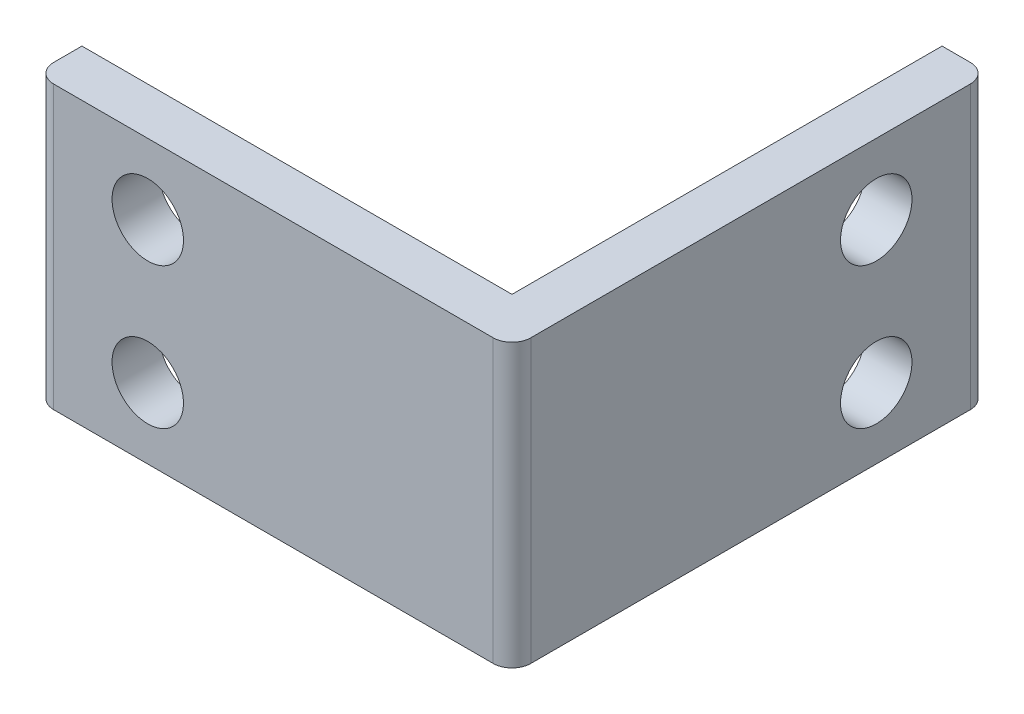
ISO-10303-21;
HEADER;
FILE_DESCRIPTION(('STEP AP214'),'2;1');
FILE_NAME('part.step','',(''),(''),'','','');
FILE_SCHEMA(('AUTOMOTIVE_DESIGN { 1 0 10303 214 1 1 1 1 }'));
ENDSEC;
DATA;
#1=APPLICATION_CONTEXT('core data for automotive mechanical design processes');
#2=APPLICATION_PROTOCOL_DEFINITION('international standard','automotive_design',2000,#1);
#3=PRODUCT_CONTEXT('',#1,'mechanical');
#4=PRODUCT('Part','Part','',(#3));
#5=PRODUCT_RELATED_PRODUCT_CATEGORY('part','',(#4));
#6=PRODUCT_DEFINITION_FORMATION('','',#4);
#7=PRODUCT_DEFINITION_CONTEXT('part definition',#1,'design');
#8=PRODUCT_DEFINITION('design','',#6,#7);
#9=PRODUCT_DEFINITION_SHAPE('','',#8);
#10=(LENGTH_UNIT() NAMED_UNIT(*) SI_UNIT(.MILLI.,.METRE.));
#11=(NAMED_UNIT(*) PLANE_ANGLE_UNIT() SI_UNIT($,.RADIAN.));
#12=(NAMED_UNIT(*) SI_UNIT($,.STERADIAN.) SOLID_ANGLE_UNIT());
#13=UNCERTAINTY_MEASURE_WITH_UNIT(LENGTH_MEASURE(1.E-05),#10,'distance_accuracy_value','');
#14=(GEOMETRIC_REPRESENTATION_CONTEXT(3) GLOBAL_UNCERTAINTY_ASSIGNED_CONTEXT((#13)) GLOBAL_UNIT_ASSIGNED_CONTEXT((#10,
#11,#12)) REPRESENTATION_CONTEXT('',''));
#15=CARTESIAN_POINT('',(0.,0.,0.));
#16=DIRECTION('',(0.,0.,1.));
#17=DIRECTION('',(1.,0.,0.));
#18=AXIS2_PLACEMENT_3D('',#15,#16,#17);
#19=CARTESIAN_POINT('',(0.,0.,-6.35));
#20=DIRECTION('',(-1.,0.,0.));
#21=DIRECTION('',(0.,0.,1.));
#22=AXIS2_PLACEMENT_3D('',#19,#20,#21);
#23=PLANE('',#22);
#24=DIRECTION('',(0.,0.,1.));
#25=VECTOR('',#24,1.);
#26=CARTESIAN_POINT('',(0.,0.,-6.35));
#27=LINE('',#26,#25);
#28=CARTESIAN_POINT('',(0.,0.,-6.35));
#29=VERTEX_POINT('',#28);
#30=CARTESIAN_POINT('',(0.,0.,-2.54));
#31=VERTEX_POINT('',#30);
#32=EDGE_CURVE('E146',#29,#31,#27,.T.);
#33=ORIENTED_EDGE('',*,*,#32,.T.);
#34=DIRECTION('',(0.,-1.,0.));
#35=VECTOR('',#34,1.);
#36=CARTESIAN_POINT('',(0.,38.1,-2.54));
#37=LINE('',#36,#35);
#38=CARTESIAN_POINT('',(0.,38.1,-2.54));
#39=VERTEX_POINT('',#38);
#40=EDGE_CURVE('E170',#31,#39,#37,.F.);
#41=ORIENTED_EDGE('',*,*,#40,.T.);
#42=DIRECTION('',(0.,0.,1.));
#43=VECTOR('',#42,1.);
#44=CARTESIAN_POINT('',(0.,38.1,-6.35));
#45=LINE('',#44,#43);
#46=CARTESIAN_POINT('',(0.,38.1,-6.35));
#47=VERTEX_POINT('',#46);
#48=EDGE_CURVE('E150',#47,#39,#45,.T.);
#49=ORIENTED_EDGE('',*,*,#48,.F.);
#50=DIRECTION('',(0.,-1.,0.));
#51=VECTOR('',#50,1.);
#52=CARTESIAN_POINT('',(0.,0.,-6.35));
#53=LINE('',#52,#51);
#54=EDGE_CURVE('E139',#47,#29,#53,.T.);
#55=ORIENTED_EDGE('',*,*,#54,.T.);
#56=EDGE_LOOP('',(#33,#41,#49,#55));
#57=FACE_BOUND('',#56,.T.);
#58=ADVANCED_FACE('F35',(#57),#23,.T.);
#59=CARTESIAN_POINT('',(0.,38.1,-6.35));
#60=DIRECTION('',(0.,1.,0.));
#61=DIRECTION('',(0.,0.,1.));
#62=AXIS2_PLACEMENT_3D('',#59,#60,#61);
#63=PLANE('',#62);
#64=DIRECTION('',(-1.,0.,0.));
#65=VECTOR('',#64,1.);
#66=CARTESIAN_POINT('',(0.,38.1,0.));
#67=LINE('',#66,#65);
#68=CARTESIAN_POINT('',(61.8998,38.1,0.));
#69=VERTEX_POINT('',#68);
#70=CARTESIAN_POINT('',(2.54,38.1,0.));
#71=VERTEX_POINT('',#70);
#72=EDGE_CURVE('E142',#69,#71,#67,.T.);
#73=ORIENTED_EDGE('',*,*,#72,.F.);
#74=CARTESIAN_POINT('',(61.8998,38.1,-2.54));
#75=DIRECTION('',(0.,1.,0.));
#76=DIRECTION('',(0.,0.,1.));
#77=AXIS2_PLACEMENT_3D('',#74,#75,#76);
#78=CIRCLE('',#77,2.54);
#79=CARTESIAN_POINT('',(64.4398,38.1,-2.54));
#80=VERTEX_POINT('',#79);
#81=EDGE_CURVE('E57',#69,#80,#78,.T.);
#82=ORIENTED_EDGE('',*,*,#81,.T.);
#83=DIRECTION('',(0.,0.,1.));
#84=VECTOR('',#83,1.);
#85=CARTESIAN_POINT('',(64.4398,38.1,-6.35));
#86=LINE('',#85,#84);
#87=CARTESIAN_POINT('',(64.4398,38.1,-61.8998));
#88=VERTEX_POINT('',#87);
#89=EDGE_CURVE('E154',#88,#80,#86,.T.);
#90=ORIENTED_EDGE('',*,*,#89,.F.);
#91=CARTESIAN_POINT('',(61.8998,38.1,-61.8998));
#92=DIRECTION('',(0.,1.,0.));
#93=DIRECTION('',(0.,0.,1.));
#94=AXIS2_PLACEMENT_3D('',#91,#92,#93);
#95=CIRCLE('',#94,2.54);
#96=CARTESIAN_POINT('',(61.8998,38.1,-64.4398));
#97=VERTEX_POINT('',#96);
#98=EDGE_CURVE('E178',#88,#97,#95,.T.);
#99=ORIENTED_EDGE('',*,*,#98,.T.);
#100=DIRECTION('',(1.,0.,0.));
#101=VECTOR('',#100,1.);
#102=CARTESIAN_POINT('',(58.0898,38.1,-64.4398));
#103=LINE('',#102,#101);
#104=CARTESIAN_POINT('',(58.0898,38.1,-64.4398));
#105=VERTEX_POINT('',#104);
#106=EDGE_CURVE('E126',#105,#97,#103,.T.);
#107=ORIENTED_EDGE('',*,*,#106,.F.);
#108=DIRECTION('',(0.,0.,1.));
#109=VECTOR('',#108,1.);
#110=CARTESIAN_POINT('',(58.0898,38.1,0.));
#111=LINE('',#110,#109);
#112=CARTESIAN_POINT('',(58.0898,38.1,-6.35));
#113=VERTEX_POINT('',#112);
#114=EDGE_CURVE('E127',#105,#113,#111,.T.);
#115=ORIENTED_EDGE('',*,*,#114,.T.);
#116=DIRECTION('',(-1.,0.,0.));
#117=VECTOR('',#116,1.);
#118=CARTESIAN_POINT('',(0.,38.1,-6.35));
#119=LINE('',#118,#117);
#120=EDGE_CURVE('E144',#113,#47,#119,.T.);
#121=ORIENTED_EDGE('',*,*,#120,.T.);
#122=ORIENTED_EDGE('',*,*,#48,.T.);
#123=CARTESIAN_POINT('',(2.54,38.1,-2.54));
#124=DIRECTION('',(0.,1.,0.));
#125=DIRECTION('',(0.,0.,1.));
#126=AXIS2_PLACEMENT_3D('',#123,#124,#125);
#127=CIRCLE('',#126,2.54);
#128=EDGE_CURVE('E172',#39,#71,#127,.T.);
#129=ORIENTED_EDGE('',*,*,#128,.T.);
#130=EDGE_LOOP('',(#73,#82,#90,#99,#107,#115,#121,#122,#129));
#131=FACE_BOUND('',#130,.T.);
#132=ADVANCED_FACE('F192',(#131),#63,.T.);
#133=CARTESIAN_POINT('',(64.4398,0.,-6.35));
#134=DIRECTION('',(1.,0.,0.));
#135=DIRECTION('',(0.,0.,-1.));
#136=AXIS2_PLACEMENT_3D('',#133,#134,#135);
#137=PLANE('',#136);
#138=CARTESIAN_POINT('',(64.4398,28.575,-49.1998));
#139=DIRECTION('',(1.,0.,0.));
#140=DIRECTION('',(0.,0.,-1.));
#141=AXIS2_PLACEMENT_3D('',#138,#139,#140);
#142=CIRCLE('',#141,4.826);
#143=CARTESIAN_POINT('',(64.4398,28.575,-54.0258));
#144=VERTEX_POINT('',#143);
#145=EDGE_CURVE('E163',#144,#144,#142,.T.);
#146=ORIENTED_EDGE('',*,*,#145,.F.);
#147=EDGE_LOOP('',(#146));
#148=FACE_BOUND('',#147,.T.);
#149=CARTESIAN_POINT('',(64.4398,9.52499999999998,-49.1998));
#150=DIRECTION('',(1.,0.,0.));
#151=DIRECTION('',(0.,0.,1.));
#152=AXIS2_PLACEMENT_3D('',#149,#150,#151);
#153=CIRCLE('',#152,4.826);
#154=CARTESIAN_POINT('',(64.4398,9.52499999999998,-44.3738));
#155=VERTEX_POINT('',#154);
#156=EDGE_CURVE('E261',#155,#155,#153,.T.);
#157=ORIENTED_EDGE('',*,*,#156,.F.);
#158=EDGE_LOOP('',(#157));
#159=FACE_BOUND('',#158,.T.);
#160=ORIENTED_EDGE('',*,*,#89,.T.);
#161=DIRECTION('',(0.,1.,0.));
#162=VECTOR('',#161,1.);
#163=CARTESIAN_POINT('',(64.4398,0.,-2.54));
#164=LINE('',#163,#162);
#165=CARTESIAN_POINT('',(64.4398,0.,-2.54));
#166=VERTEX_POINT('',#165);
#167=EDGE_CURVE('E43',#80,#166,#164,.F.);
#168=ORIENTED_EDGE('',*,*,#167,.T.);
#169=DIRECTION('',(0.,0.,1.));
#170=VECTOR('',#169,1.);
#171=CARTESIAN_POINT('',(64.4398,0.,-6.35));
#172=LINE('',#171,#170);
#173=CARTESIAN_POINT('',(64.4398,0.,-61.8998));
#174=VERTEX_POINT('',#173);
#175=EDGE_CURVE('E156',#174,#166,#172,.T.);
#176=ORIENTED_EDGE('',*,*,#175,.F.);
#177=DIRECTION('',(0.,1.,0.));
#178=VECTOR('',#177,1.);
#179=CARTESIAN_POINT('',(64.4398,0.,-61.8998));
#180=LINE('',#179,#178);
#181=EDGE_CURVE('E175',#174,#88,#180,.T.);
#182=ORIENTED_EDGE('',*,*,#181,.T.);
#183=EDGE_LOOP('',(#160,#168,#176,#182));
#184=FACE_BOUND('',#183,.T.);
#185=ADVANCED_FACE('F211',(#148,#159,#184),#137,.T.);
#186=CARTESIAN_POINT('',(0.,0.,-6.35));
#187=DIRECTION('',(0.,-1.,0.));
#188=DIRECTION('',(0.,0.,-1.));
#189=AXIS2_PLACEMENT_3D('',#186,#187,#188);
#190=PLANE('',#189);
#191=ORIENTED_EDGE('',*,*,#175,.T.);
#192=CARTESIAN_POINT('',(61.8998,0.,-2.54));
#193=DIRECTION('',(0.,-1.,0.));
#194=DIRECTION('',(0.,0.,-1.));
#195=AXIS2_PLACEMENT_3D('',#192,#193,#194);
#196=CIRCLE('',#195,2.54);
#197=CARTESIAN_POINT('',(61.8998,0.,0.));
#198=VERTEX_POINT('',#197);
#199=EDGE_CURVE('E11',#166,#198,#196,.T.);
#200=ORIENTED_EDGE('',*,*,#199,.T.);
#201=DIRECTION('',(1.,0.,0.));
#202=VECTOR('',#201,1.);
#203=CARTESIAN_POINT('',(0.,0.,0.));
#204=LINE('',#203,#202);
#205=CARTESIAN_POINT('',(2.54,0.,0.));
#206=VERTEX_POINT('',#205);
#207=EDGE_CURVE('E138',#206,#198,#204,.T.);
#208=ORIENTED_EDGE('',*,*,#207,.F.);
#209=CARTESIAN_POINT('',(2.54,0.,-2.54));
#210=DIRECTION('',(0.,-1.,0.));
#211=DIRECTION('',(0.,0.,-1.));
#212=AXIS2_PLACEMENT_3D('',#209,#210,#211);
#213=CIRCLE('',#212,2.54);
#214=EDGE_CURVE('E168',#206,#31,#213,.T.);
#215=ORIENTED_EDGE('',*,*,#214,.T.);
#216=ORIENTED_EDGE('',*,*,#32,.F.);
#217=DIRECTION('',(1.,0.,0.));
#218=VECTOR('',#217,1.);
#219=CARTESIAN_POINT('',(0.,0.,-6.35));
#220=LINE('',#219,#218);
#221=CARTESIAN_POINT('',(58.0898,0.,-6.35));
#222=VERTEX_POINT('',#221);
#223=EDGE_CURVE('E112',#29,#222,#220,.T.);
#224=ORIENTED_EDGE('',*,*,#223,.T.);
#225=DIRECTION('',(0.,0.,-1.));
#226=VECTOR('',#225,1.);
#227=CARTESIAN_POINT('',(58.0898,0.,0.));
#228=LINE('',#227,#226);
#229=CARTESIAN_POINT('',(58.0898,0.,-64.4398));
#230=VERTEX_POINT('',#229);
#231=EDGE_CURVE('E106',#222,#230,#228,.T.);
#232=ORIENTED_EDGE('',*,*,#231,.T.);
#233=DIRECTION('',(1.,0.,0.));
#234=VECTOR('',#233,1.);
#235=CARTESIAN_POINT('',(58.0898,0.,-64.4398));
#236=LINE('',#235,#234);
#237=CARTESIAN_POINT('',(61.8998,0.,-64.4398));
#238=VERTEX_POINT('',#237);
#239=EDGE_CURVE('E109',#230,#238,#236,.T.);
#240=ORIENTED_EDGE('',*,*,#239,.T.);
#241=CARTESIAN_POINT('',(61.8998,0.,-61.8998));
#242=DIRECTION('',(0.,-1.,0.));
#243=DIRECTION('',(0.,0.,-1.));
#244=AXIS2_PLACEMENT_3D('',#241,#242,#243);
#245=CIRCLE('',#244,2.54);
#246=EDGE_CURVE('E181',#238,#174,#245,.T.);
#247=ORIENTED_EDGE('',*,*,#246,.T.);
#248=EDGE_LOOP('',(#191,#200,#208,#215,#216,#224,#232,#240,#247));
#249=FACE_BOUND('',#248,.T.);
#250=ADVANCED_FACE('F108',(#249),#190,.T.);
#251=CARTESIAN_POINT('',(0.,0.,-6.35));
#252=DIRECTION('',(0.,0.,-1.));
#253=DIRECTION('',(-1.,0.,0.));
#254=AXIS2_PLACEMENT_3D('',#251,#252,#253);
#255=PLANE('',#254);
#256=CARTESIAN_POINT('',(15.24,28.575,-6.35));
#257=DIRECTION('',(0.,0.,-1.));
#258=DIRECTION('',(-1.,0.,0.));
#259=AXIS2_PLACEMENT_3D('',#256,#257,#258);
#260=CIRCLE('',#259,4.826);
#261=CARTESIAN_POINT('',(10.414,28.575,-6.35));
#262=VERTEX_POINT('',#261);
#263=EDGE_CURVE('E267',#262,#262,#260,.T.);
#264=ORIENTED_EDGE('',*,*,#263,.F.);
#265=EDGE_LOOP('',(#264));
#266=FACE_BOUND('',#265,.T.);
#267=CARTESIAN_POINT('',(15.24,9.525,-6.35));
#268=DIRECTION('',(0.,0.,-1.));
#269=DIRECTION('',(-1.,0.,0.));
#270=AXIS2_PLACEMENT_3D('',#267,#268,#269);
#271=CIRCLE('',#270,4.826);
#272=CARTESIAN_POINT('',(10.414,9.525,-6.35));
#273=VERTEX_POINT('',#272);
#274=EDGE_CURVE('E269',#273,#273,#271,.T.);
#275=ORIENTED_EDGE('',*,*,#274,.F.);
#276=EDGE_LOOP('',(#275));
#277=FACE_BOUND('',#276,.T.);
#278=DIRECTION('',(0.,1.,0.));
#279=VECTOR('',#278,1.);
#280=CARTESIAN_POINT('',(58.0898,0.,-6.35));
#281=LINE('',#280,#279);
#282=EDGE_CURVE('E135',#222,#113,#281,.T.);
#283=ORIENTED_EDGE('',*,*,#282,.F.);
#284=ORIENTED_EDGE('',*,*,#223,.F.);
#285=ORIENTED_EDGE('',*,*,#54,.F.);
#286=ORIENTED_EDGE('',*,*,#120,.F.);
#287=EDGE_LOOP('',(#283,#284,#285,#286));
#288=FACE_BOUND('',#287,.T.);
#289=ADVANCED_FACE('F245',(#266,#277,#288),#255,.T.);
#290=CARTESIAN_POINT('',(0.,0.,0.));
#291=DIRECTION('',(0.,0.,-1.));
#292=DIRECTION('',(-1.,0.,0.));
#293=AXIS2_PLACEMENT_3D('',#290,#291,#292);
#294=PLANE('',#293);
#295=CARTESIAN_POINT('',(15.24,28.575,0.));
#296=DIRECTION('',(0.,0.,1.));
#297=DIRECTION('',(1.,0.,0.));
#298=AXIS2_PLACEMENT_3D('',#295,#296,#297);
#299=CIRCLE('',#298,4.826);
#300=CARTESIAN_POINT('',(20.066,28.575,0.));
#301=VERTEX_POINT('',#300);
#302=EDGE_CURVE('E274',#301,#301,#299,.T.);
#303=ORIENTED_EDGE('',*,*,#302,.F.);
#304=EDGE_LOOP('',(#303));
#305=FACE_BOUND('',#304,.T.);
#306=CARTESIAN_POINT('',(15.24,9.525,0.));
#307=DIRECTION('',(0.,0.,1.));
#308=DIRECTION('',(-1.,0.,0.));
#309=AXIS2_PLACEMENT_3D('',#306,#307,#308);
#310=CIRCLE('',#309,4.826);
#311=CARTESIAN_POINT('',(10.414,9.525,0.));
#312=VERTEX_POINT('',#311);
#313=EDGE_CURVE('E275',#312,#312,#310,.T.);
#314=ORIENTED_EDGE('',*,*,#313,.F.);
#315=EDGE_LOOP('',(#314));
#316=FACE_BOUND('',#315,.T.);
#317=ORIENTED_EDGE('',*,*,#207,.T.);
#318=DIRECTION('',(0.,1.,0.));
#319=VECTOR('',#318,1.);
#320=CARTESIAN_POINT('',(61.8998,38.1,0.));
#321=LINE('',#320,#319);
#322=EDGE_CURVE('E183',#198,#69,#321,.T.);
#323=ORIENTED_EDGE('',*,*,#322,.T.);
#324=ORIENTED_EDGE('',*,*,#72,.T.);
#325=DIRECTION('',(0.,-1.,0.));
#326=VECTOR('',#325,1.);
#327=CARTESIAN_POINT('',(2.54,0.,0.));
#328=LINE('',#327,#326);
#329=EDGE_CURVE('E153',#71,#206,#328,.T.);
#330=ORIENTED_EDGE('',*,*,#329,.T.);
#331=EDGE_LOOP('',(#317,#323,#324,#330));
#332=FACE_BOUND('',#331,.T.);
#333=ADVANCED_FACE('F188',(#305,#316,#332),#294,.F.);
#334=CARTESIAN_POINT('',(58.0898,0.,-64.4398));
#335=DIRECTION('',(0.,0.,-1.));
#336=DIRECTION('',(-1.,0.,0.));
#337=AXIS2_PLACEMENT_3D('',#334,#335,#336);
#338=PLANE('',#337);
#339=ORIENTED_EDGE('',*,*,#106,.T.);
#340=DIRECTION('',(0.,1.,0.));
#341=VECTOR('',#340,1.);
#342=CARTESIAN_POINT('',(61.8998,0.,-64.4398));
#343=LINE('',#342,#341);
#344=EDGE_CURVE('E125',#97,#238,#343,.F.);
#345=ORIENTED_EDGE('',*,*,#344,.T.);
#346=ORIENTED_EDGE('',*,*,#239,.F.);
#347=DIRECTION('',(0.,1.,0.));
#348=VECTOR('',#347,1.);
#349=CARTESIAN_POINT('',(58.0898,0.,-64.4398));
#350=LINE('',#349,#348);
#351=EDGE_CURVE('E116',#230,#105,#350,.T.);
#352=ORIENTED_EDGE('',*,*,#351,.T.);
#353=EDGE_LOOP('',(#339,#345,#346,#352));
#354=FACE_BOUND('',#353,.T.);
#355=ADVANCED_FACE('F122',(#354),#338,.T.);
#356=CARTESIAN_POINT('',(58.0898,0.,0.));
#357=DIRECTION('',(-1.,0.,0.));
#358=DIRECTION('',(0.,0.,1.));
#359=AXIS2_PLACEMENT_3D('',#356,#357,#358);
#360=PLANE('',#359);
#361=CARTESIAN_POINT('',(58.0898,28.575,-49.1998));
#362=DIRECTION('',(-1.,0.,0.));
#363=DIRECTION('',(0.,0.,1.));
#364=AXIS2_PLACEMENT_3D('',#361,#362,#363);
#365=CIRCLE('',#364,4.826);
#366=CARTESIAN_POINT('',(58.0898,28.575,-44.3738));
#367=VERTEX_POINT('',#366);
#368=EDGE_CURVE('E117',#367,#367,#365,.T.);
#369=ORIENTED_EDGE('',*,*,#368,.F.);
#370=EDGE_LOOP('',(#369));
#371=FACE_BOUND('',#370,.T.);
#372=CARTESIAN_POINT('',(58.0898,9.52499999999998,-49.1998));
#373=DIRECTION('',(-1.,0.,0.));
#374=DIRECTION('',(0.,0.,1.));
#375=AXIS2_PLACEMENT_3D('',#372,#373,#374);
#376=CIRCLE('',#375,4.826);
#377=CARTESIAN_POINT('',(58.0898,9.52499999999998,-44.3738));
#378=VERTEX_POINT('',#377);
#379=EDGE_CURVE('E160',#378,#378,#376,.T.);
#380=ORIENTED_EDGE('',*,*,#379,.F.);
#381=EDGE_LOOP('',(#380));
#382=FACE_BOUND('',#381,.T.);
#383=ORIENTED_EDGE('',*,*,#231,.F.);
#384=ORIENTED_EDGE('',*,*,#282,.T.);
#385=ORIENTED_EDGE('',*,*,#114,.F.);
#386=ORIENTED_EDGE('',*,*,#351,.F.);
#387=EDGE_LOOP('',(#383,#384,#385,#386));
#388=FACE_BOUND('',#387,.T.);
#389=ADVANCED_FACE('F129',(#371,#382,#388),#360,.T.);
#390=CARTESIAN_POINT('',(0.,9.52499999999998,-49.1998));
#391=DIRECTION('',(1.,0.,0.));
#392=DIRECTION('',(0.,0.,-1.));
#393=AXIS2_PLACEMENT_3D('',#390,#391,#392);
#394=CYLINDRICAL_SURFACE('',#393,4.826);
#395=ORIENTED_EDGE('',*,*,#379,.T.);
#396=EDGE_LOOP('',(#395));
#397=FACE_BOUND('',#396,.T.);
#398=ORIENTED_EDGE('',*,*,#156,.T.);
#399=EDGE_LOOP('',(#398));
#400=FACE_BOUND('',#399,.T.);
#401=ADVANCED_FACE('F235',(#397,#400),#394,.F.);
#402=CARTESIAN_POINT('',(0.,28.575,-49.1998));
#403=DIRECTION('',(1.,0.,0.));
#404=DIRECTION('',(0.,0.,-1.));
#405=AXIS2_PLACEMENT_3D('',#402,#403,#404);
#406=CYLINDRICAL_SURFACE('',#405,4.826);
#407=ORIENTED_EDGE('',*,*,#368,.T.);
#408=EDGE_LOOP('',(#407));
#409=FACE_BOUND('',#408,.T.);
#410=ORIENTED_EDGE('',*,*,#145,.T.);
#411=EDGE_LOOP('',(#410));
#412=FACE_BOUND('',#411,.T.);
#413=ADVANCED_FACE('F227',(#409,#412),#406,.F.);
#414=CARTESIAN_POINT('',(15.24,9.525,-64.4398));
#415=DIRECTION('',(0.,0.,1.));
#416=DIRECTION('',(1.,0.,0.));
#417=AXIS2_PLACEMENT_3D('',#414,#415,#416);
#418=CYLINDRICAL_SURFACE('',#417,4.826);
#419=ORIENTED_EDGE('',*,*,#274,.T.);
#420=EDGE_LOOP('',(#419));
#421=FACE_BOUND('',#420,.T.);
#422=ORIENTED_EDGE('',*,*,#313,.T.);
#423=EDGE_LOOP('',(#422));
#424=FACE_BOUND('',#423,.T.);
#425=ADVANCED_FACE('F221',(#421,#424),#418,.F.);
#426=CARTESIAN_POINT('',(15.24,28.575,-64.4398));
#427=DIRECTION('',(0.,0.,1.));
#428=DIRECTION('',(1.,0.,0.));
#429=AXIS2_PLACEMENT_3D('',#426,#427,#428);
#430=CYLINDRICAL_SURFACE('',#429,4.826);
#431=ORIENTED_EDGE('',*,*,#263,.T.);
#432=EDGE_LOOP('',(#431));
#433=FACE_BOUND('',#432,.T.);
#434=ORIENTED_EDGE('',*,*,#302,.T.);
#435=EDGE_LOOP('',(#434));
#436=FACE_BOUND('',#435,.T.);
#437=ADVANCED_FACE('F217',(#433,#436),#430,.F.);
#438=CARTESIAN_POINT('',(2.54,0.,-2.54));
#439=DIRECTION('',(0.,1.,0.));
#440=DIRECTION('',(0.,0.,1.));
#441=AXIS2_PLACEMENT_3D('',#438,#439,#440);
#442=CYLINDRICAL_SURFACE('',#441,2.54);
#443=ORIENTED_EDGE('',*,*,#128,.F.);
#444=ORIENTED_EDGE('',*,*,#40,.F.);
#445=ORIENTED_EDGE('',*,*,#214,.F.);
#446=ORIENTED_EDGE('',*,*,#329,.F.);
#447=EDGE_LOOP('',(#443,#444,#445,#446));
#448=FACE_BOUND('',#447,.T.);
#449=ADVANCED_FACE('F198',(#448),#442,.T.);
#450=CARTESIAN_POINT('',(61.8998,0.,-61.8998));
#451=DIRECTION('',(0.,1.,0.));
#452=DIRECTION('',(0.,0.,1.));
#453=AXIS2_PLACEMENT_3D('',#450,#451,#452);
#454=CYLINDRICAL_SURFACE('',#453,2.54);
#455=ORIENTED_EDGE('',*,*,#246,.F.);
#456=ORIENTED_EDGE('',*,*,#344,.F.);
#457=ORIENTED_EDGE('',*,*,#98,.F.);
#458=ORIENTED_EDGE('',*,*,#181,.F.);
#459=EDGE_LOOP('',(#455,#456,#457,#458));
#460=FACE_BOUND('',#459,.T.);
#461=ADVANCED_FACE('F200',(#460),#454,.T.);
#462=CARTESIAN_POINT('',(61.8998,0.,-2.54));
#463=DIRECTION('',(0.,-1.,0.));
#464=DIRECTION('',(0.,0.,-1.));
#465=AXIS2_PLACEMENT_3D('',#462,#463,#464);
#466=CYLINDRICAL_SURFACE('',#465,2.54);
#467=ORIENTED_EDGE('',*,*,#199,.F.);
#468=ORIENTED_EDGE('',*,*,#167,.F.);
#469=ORIENTED_EDGE('',*,*,#81,.F.);
#470=ORIENTED_EDGE('',*,*,#322,.F.);
#471=EDGE_LOOP('',(#467,#468,#469,#470));
#472=FACE_BOUND('',#471,.T.);
#473=ADVANCED_FACE('F37',(#472),#466,.T.);
#474=CLOSED_SHELL('',(#58,#132,#185,#250,#289,#333,#355,#389,#401,#413,#425,#437,#449,#461,#473));
#475=MANIFOLD_SOLID_BREP('B2',#474);
#476=ADVANCED_BREP_SHAPE_REPRESENTATION('',(#18,#475),#14);
#477=SHAPE_DEFINITION_REPRESENTATION(#9,#476);
ENDSEC;
END-ISO-10303-21;
